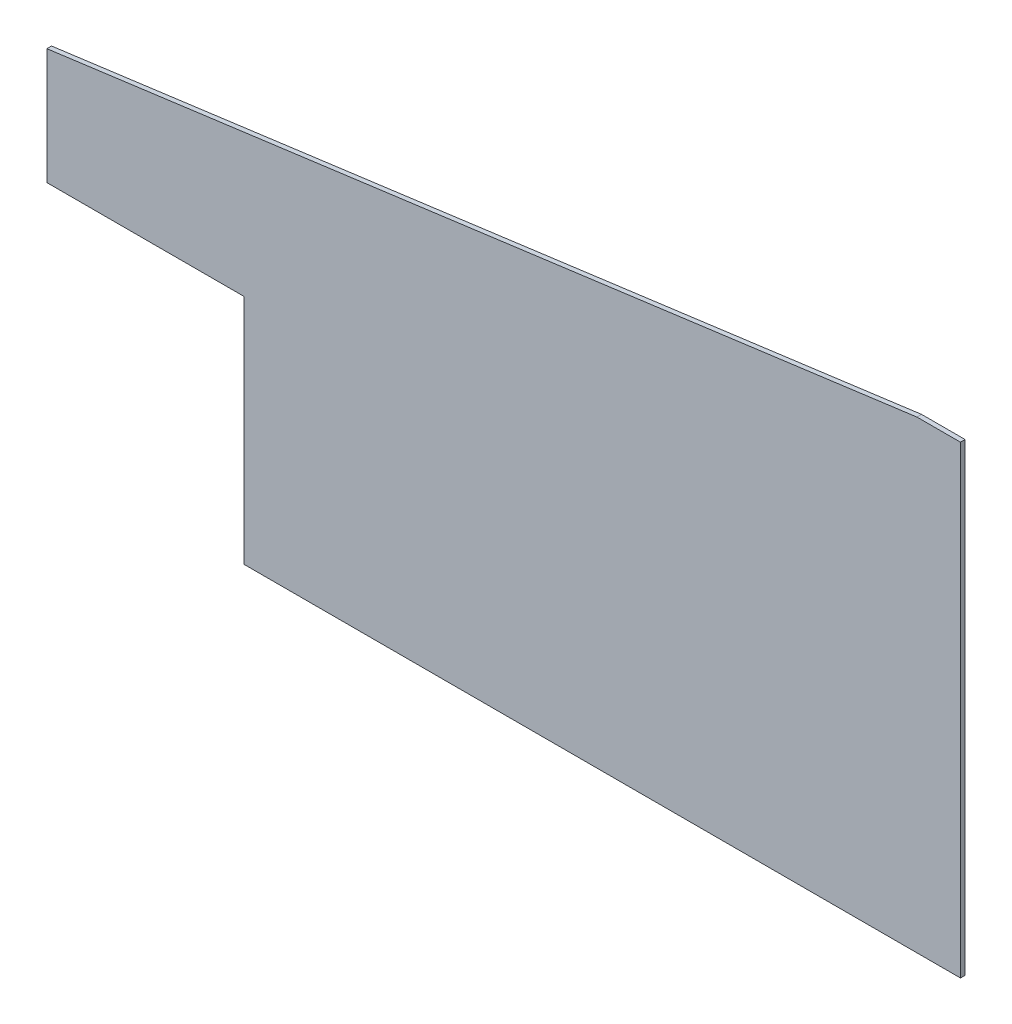
ISO-10303-21;
HEADER;
FILE_DESCRIPTION(('STEP AP214'),'2;1');
FILE_NAME('part.step','',(''),(''),'','','');
FILE_SCHEMA(('AUTOMOTIVE_DESIGN { 1 0 10303 214 1 1 1 1 }'));
ENDSEC;
DATA;
#1=APPLICATION_CONTEXT('core data for automotive mechanical design processes');
#2=APPLICATION_PROTOCOL_DEFINITION('international standard','automotive_design',2000,#1);
#3=PRODUCT_CONTEXT('',#1,'mechanical');
#4=PRODUCT('Part','Part','',(#3));
#5=PRODUCT_RELATED_PRODUCT_CATEGORY('part','',(#4));
#6=PRODUCT_DEFINITION_FORMATION('','',#4);
#7=PRODUCT_DEFINITION_CONTEXT('part definition',#1,'design');
#8=PRODUCT_DEFINITION('design','',#6,#7);
#9=PRODUCT_DEFINITION_SHAPE('','',#8);
#10=(LENGTH_UNIT() NAMED_UNIT(*) SI_UNIT(.MILLI.,.METRE.));
#11=(NAMED_UNIT(*) PLANE_ANGLE_UNIT() SI_UNIT($,.RADIAN.));
#12=(NAMED_UNIT(*) SI_UNIT($,.STERADIAN.) SOLID_ANGLE_UNIT());
#13=UNCERTAINTY_MEASURE_WITH_UNIT(LENGTH_MEASURE(1.E-05),#10,'distance_accuracy_value','');
#14=(GEOMETRIC_REPRESENTATION_CONTEXT(3) GLOBAL_UNCERTAINTY_ASSIGNED_CONTEXT((#13)) GLOBAL_UNIT_ASSIGNED_CONTEXT((#10,
#11,#12)) REPRESENTATION_CONTEXT('',''));
#15=CARTESIAN_POINT('',(0.,0.,0.));
#16=DIRECTION('',(0.,0.,1.));
#17=DIRECTION('',(1.,0.,0.));
#18=AXIS2_PLACEMENT_3D('',#15,#16,#17);
#19=CARTESIAN_POINT('',(0.,0.,4.));
#20=DIRECTION('',(0.,-1.,0.));
#21=DIRECTION('',(1.,0.,0.));
#22=AXIS2_PLACEMENT_3D('',#19,#20,#21);
#23=PLANE('',#22);
#24=DIRECTION('',(-1.,0.,0.));
#25=VECTOR('',#24,1.);
#26=CARTESIAN_POINT('',(0.,0.,0.));
#27=LINE('',#26,#25);
#28=CARTESIAN_POINT('',(0.,0.,0.));
#29=VERTEX_POINT('',#28);
#30=CARTESIAN_POINT('',(-37.5,0.,0.));
#31=VERTEX_POINT('',#30);
#32=EDGE_CURVE('E122',#29,#31,#27,.T.);
#33=ORIENTED_EDGE('',*,*,#32,.T.);
#34=DIRECTION('',(0.,0.,-1.));
#35=VECTOR('',#34,1.);
#36=CARTESIAN_POINT('',(-37.5,0.,4.));
#37=LINE('',#36,#35);
#38=CARTESIAN_POINT('',(-37.5,0.,4.));
#39=VERTEX_POINT('',#38);
#40=EDGE_CURVE('E11',#39,#31,#37,.T.);
#41=ORIENTED_EDGE('',*,*,#40,.F.);
#42=DIRECTION('',(-1.,0.,0.));
#43=VECTOR('',#42,1.);
#44=CARTESIAN_POINT('',(0.,0.,4.));
#45=LINE('',#44,#43);
#46=CARTESIAN_POINT('',(0.,0.,4.));
#47=VERTEX_POINT('',#46);
#48=EDGE_CURVE('E134',#47,#39,#45,.T.);
#49=ORIENTED_EDGE('',*,*,#48,.F.);
#50=DIRECTION('',(0.,0.,-1.));
#51=VECTOR('',#50,1.);
#52=CARTESIAN_POINT('',(0.,0.,4.));
#53=LINE('',#52,#51);
#54=EDGE_CURVE('E118',#47,#29,#53,.T.);
#55=ORIENTED_EDGE('',*,*,#54,.T.);
#56=EDGE_LOOP('',(#33,#41,#49,#55));
#57=FACE_BOUND('',#56,.T.);
#58=ADVANCED_FACE('F32',(#57),#23,.F.);
#59=CARTESIAN_POINT('',(-787.5,-100.,4.));
#60=DIRECTION('',(0.132163720091018,-0.991227900682635,0.));
#61=DIRECTION('',(0.991227900682635,0.132163720091018,0.));
#62=AXIS2_PLACEMENT_3D('',#59,#60,#61);
#63=PLANE('',#62);
#64=DIRECTION('',(-0.991227900682635,-0.132163720091018,0.));
#65=VECTOR('',#64,1.);
#66=CARTESIAN_POINT('',(-787.5,-100.,0.));
#67=LINE('',#66,#65);
#68=CARTESIAN_POINT('',(-787.5,-100.,0.));
#69=VERTEX_POINT('',#68);
#70=EDGE_CURVE('E125',#31,#69,#67,.T.);
#71=ORIENTED_EDGE('',*,*,#70,.T.);
#72=DIRECTION('',(0.,0.,-1.));
#73=VECTOR('',#72,1.);
#74=CARTESIAN_POINT('',(-787.5,-100.,4.));
#75=LINE('',#74,#73);
#76=CARTESIAN_POINT('',(-787.5,-100.,4.));
#77=VERTEX_POINT('',#76);
#78=EDGE_CURVE('E40',#77,#69,#75,.T.);
#79=ORIENTED_EDGE('',*,*,#78,.F.);
#80=DIRECTION('',(-0.991227900682635,-0.132163720091018,0.));
#81=VECTOR('',#80,1.);
#82=CARTESIAN_POINT('',(-787.5,-100.,4.));
#83=LINE('',#82,#81);
#84=EDGE_CURVE('E88',#39,#77,#83,.T.);
#85=ORIENTED_EDGE('',*,*,#84,.F.);
#86=ORIENTED_EDGE('',*,*,#40,.T.);
#87=EDGE_LOOP('',(#71,#79,#85,#86));
#88=FACE_BOUND('',#87,.T.);
#89=ADVANCED_FACE('F159',(#88),#63,.F.);
#90=CARTESIAN_POINT('',(-787.5,-100.,4.));
#91=DIRECTION('',(1.,0.,0.));
#92=DIRECTION('',(0.,0.,-1.));
#93=AXIS2_PLACEMENT_3D('',#90,#91,#92);
#94=PLANE('',#93);
#95=DIRECTION('',(0.,-1.,0.));
#96=VECTOR('',#95,1.);
#97=CARTESIAN_POINT('',(-787.5,-100.,0.));
#98=LINE('',#97,#96);
#99=CARTESIAN_POINT('',(-787.5,-200.,0.));
#100=VERTEX_POINT('',#99);
#101=EDGE_CURVE('E127',#69,#100,#98,.T.);
#102=ORIENTED_EDGE('',*,*,#101,.T.);
#103=DIRECTION('',(0.,0.,-1.));
#104=VECTOR('',#103,1.);
#105=CARTESIAN_POINT('',(-787.5,-200.,4.));
#106=LINE('',#105,#104);
#107=CARTESIAN_POINT('',(-787.5,-200.,4.));
#108=VERTEX_POINT('',#107);
#109=EDGE_CURVE('E138',#108,#100,#106,.T.);
#110=ORIENTED_EDGE('',*,*,#109,.F.);
#111=DIRECTION('',(0.,-1.,0.));
#112=VECTOR('',#111,1.);
#113=CARTESIAN_POINT('',(-787.5,-100.,4.));
#114=LINE('',#113,#112);
#115=EDGE_CURVE('E146',#77,#108,#114,.T.);
#116=ORIENTED_EDGE('',*,*,#115,.F.);
#117=ORIENTED_EDGE('',*,*,#78,.T.);
#118=EDGE_LOOP('',(#102,#110,#116,#117));
#119=FACE_BOUND('',#118,.T.);
#120=ADVANCED_FACE('F144',(#119),#94,.F.);
#121=CARTESIAN_POINT('',(-787.5,-200.,4.));
#122=DIRECTION('',(0.,1.,0.));
#123=DIRECTION('',(-1.,0.,0.));
#124=AXIS2_PLACEMENT_3D('',#121,#122,#123);
#125=PLANE('',#124);
#126=DIRECTION('',(1.,0.,0.));
#127=VECTOR('',#126,1.);
#128=CARTESIAN_POINT('',(-787.5,-200.,0.));
#129=LINE('',#128,#127);
#130=CARTESIAN_POINT('',(-617.5,-200.,0.));
#131=VERTEX_POINT('',#130);
#132=EDGE_CURVE('E129',#100,#131,#129,.T.);
#133=ORIENTED_EDGE('',*,*,#132,.T.);
#134=DIRECTION('',(0.,0.,-1.));
#135=VECTOR('',#134,1.);
#136=CARTESIAN_POINT('',(-617.5,-200.,4.));
#137=LINE('',#136,#135);
#138=CARTESIAN_POINT('',(-617.5,-200.,4.));
#139=VERTEX_POINT('',#138);
#140=EDGE_CURVE('E113',#139,#131,#137,.T.);
#141=ORIENTED_EDGE('',*,*,#140,.F.);
#142=DIRECTION('',(1.,0.,0.));
#143=VECTOR('',#142,1.);
#144=CARTESIAN_POINT('',(-787.5,-200.,4.));
#145=LINE('',#144,#143);
#146=EDGE_CURVE('E104',#108,#139,#145,.T.);
#147=ORIENTED_EDGE('',*,*,#146,.F.);
#148=ORIENTED_EDGE('',*,*,#109,.T.);
#149=EDGE_LOOP('',(#133,#141,#147,#148));
#150=FACE_BOUND('',#149,.T.);
#151=ADVANCED_FACE('F152',(#150),#125,.F.);
#152=CARTESIAN_POINT('',(-617.5,-200.,4.));
#153=DIRECTION('',(1.,0.,0.));
#154=DIRECTION('',(0.,0.,-1.));
#155=AXIS2_PLACEMENT_3D('',#152,#153,#154);
#156=PLANE('',#155);
#157=DIRECTION('',(0.,-1.,0.));
#158=VECTOR('',#157,1.);
#159=CARTESIAN_POINT('',(-617.5,-200.,0.));
#160=LINE('',#159,#158);
#161=CARTESIAN_POINT('',(-617.5,-400.,0.));
#162=VERTEX_POINT('',#161);
#163=EDGE_CURVE('E112',#131,#162,#160,.T.);
#164=ORIENTED_EDGE('',*,*,#163,.T.);
#165=DIRECTION('',(0.,0.,-1.));
#166=VECTOR('',#165,1.);
#167=CARTESIAN_POINT('',(-617.5,-400.,4.));
#168=LINE('',#167,#166);
#169=CARTESIAN_POINT('',(-617.5,-400.,4.));
#170=VERTEX_POINT('',#169);
#171=EDGE_CURVE('E109',#170,#162,#168,.T.);
#172=ORIENTED_EDGE('',*,*,#171,.F.);
#173=DIRECTION('',(0.,-1.,0.));
#174=VECTOR('',#173,1.);
#175=CARTESIAN_POINT('',(-617.5,-200.,4.));
#176=LINE('',#175,#174);
#177=EDGE_CURVE('E98',#139,#170,#176,.T.);
#178=ORIENTED_EDGE('',*,*,#177,.F.);
#179=ORIENTED_EDGE('',*,*,#140,.T.);
#180=EDGE_LOOP('',(#164,#172,#178,#179));
#181=FACE_BOUND('',#180,.T.);
#182=ADVANCED_FACE('F110',(#181),#156,.F.);
#183=CARTESIAN_POINT('',(-617.5,-400.,4.));
#184=DIRECTION('',(0.,1.,0.));
#185=DIRECTION('',(0.,0.,1.));
#186=AXIS2_PLACEMENT_3D('',#183,#184,#185);
#187=PLANE('',#186);
#188=DIRECTION('',(1.,0.,0.));
#189=VECTOR('',#188,1.);
#190=CARTESIAN_POINT('',(-617.5,-400.,0.));
#191=LINE('',#190,#189);
#192=CARTESIAN_POINT('',(0.,-400.,0.));
#193=VERTEX_POINT('',#192);
#194=EDGE_CURVE('E74',#162,#193,#191,.T.);
#195=ORIENTED_EDGE('',*,*,#194,.T.);
#196=DIRECTION('',(0.,0.,-1.));
#197=VECTOR('',#196,1.);
#198=CARTESIAN_POINT('',(0.,-400.,4.));
#199=LINE('',#198,#197);
#200=CARTESIAN_POINT('',(0.,-400.,4.));
#201=VERTEX_POINT('',#200);
#202=EDGE_CURVE('E114',#201,#193,#199,.T.);
#203=ORIENTED_EDGE('',*,*,#202,.F.);
#204=DIRECTION('',(1.,0.,0.));
#205=VECTOR('',#204,1.);
#206=CARTESIAN_POINT('',(-617.5,-400.,4.));
#207=LINE('',#206,#205);
#208=EDGE_CURVE('E102',#170,#201,#207,.T.);
#209=ORIENTED_EDGE('',*,*,#208,.F.);
#210=ORIENTED_EDGE('',*,*,#171,.T.);
#211=EDGE_LOOP('',(#195,#203,#209,#210));
#212=FACE_BOUND('',#211,.T.);
#213=ADVANCED_FACE('F116',(#212),#187,.F.);
#214=CARTESIAN_POINT('',(0.,-400.,4.));
#215=DIRECTION('',(-1.,0.,0.));
#216=DIRECTION('',(0.,0.,1.));
#217=AXIS2_PLACEMENT_3D('',#214,#215,#216);
#218=PLANE('',#217);
#219=DIRECTION('',(0.,1.,0.));
#220=VECTOR('',#219,1.);
#221=CARTESIAN_POINT('',(0.,-400.,0.));
#222=LINE('',#221,#220);
#223=EDGE_CURVE('E80',#193,#29,#222,.T.);
#224=ORIENTED_EDGE('',*,*,#223,.T.);
#225=ORIENTED_EDGE('',*,*,#54,.F.);
#226=DIRECTION('',(0.,1.,0.));
#227=VECTOR('',#226,1.);
#228=CARTESIAN_POINT('',(0.,-400.,4.));
#229=LINE('',#228,#227);
#230=EDGE_CURVE('E48',#201,#47,#229,.T.);
#231=ORIENTED_EDGE('',*,*,#230,.F.);
#232=ORIENTED_EDGE('',*,*,#202,.T.);
#233=EDGE_LOOP('',(#224,#225,#231,#232));
#234=FACE_BOUND('',#233,.T.);
#235=ADVANCED_FACE('F173',(#234),#218,.F.);
#236=CARTESIAN_POINT('',(0.,0.,4.));
#237=DIRECTION('',(0.,0.,1.));
#238=DIRECTION('',(1.,0.,0.));
#239=AXIS2_PLACEMENT_3D('',#236,#237,#238);
#240=PLANE('',#239);
#241=ORIENTED_EDGE('',*,*,#48,.T.);
#242=ORIENTED_EDGE('',*,*,#84,.T.);
#243=ORIENTED_EDGE('',*,*,#115,.T.);
#244=ORIENTED_EDGE('',*,*,#146,.T.);
#245=ORIENTED_EDGE('',*,*,#177,.T.);
#246=ORIENTED_EDGE('',*,*,#208,.T.);
#247=ORIENTED_EDGE('',*,*,#230,.T.);
#248=EDGE_LOOP('',(#241,#242,#243,#244,#245,#246,#247));
#249=FACE_BOUND('',#248,.T.);
#250=ADVANCED_FACE('F100',(#249),#240,.T.);
#251=CARTESIAN_POINT('',(0.,0.,0.));
#252=DIRECTION('',(0.,0.,1.));
#253=DIRECTION('',(1.,0.,0.));
#254=AXIS2_PLACEMENT_3D('',#251,#252,#253);
#255=PLANE('',#254);
#256=ORIENTED_EDGE('',*,*,#32,.F.);
#257=ORIENTED_EDGE('',*,*,#223,.F.);
#258=ORIENTED_EDGE('',*,*,#194,.F.);
#259=ORIENTED_EDGE('',*,*,#163,.F.);
#260=ORIENTED_EDGE('',*,*,#132,.F.);
#261=ORIENTED_EDGE('',*,*,#101,.F.);
#262=ORIENTED_EDGE('',*,*,#70,.F.);
#263=EDGE_LOOP('',(#256,#257,#258,#259,#260,#261,#262));
#264=FACE_BOUND('',#263,.T.);
#265=ADVANCED_FACE('F150',(#264),#255,.F.);
#266=CLOSED_SHELL('',(#58,#89,#120,#151,#182,#213,#235,#250,#265));
#267=MANIFOLD_SOLID_BREP('B2',#266);
#268=ADVANCED_BREP_SHAPE_REPRESENTATION('',(#18,#267),#14);
#269=SHAPE_DEFINITION_REPRESENTATION(#9,#268);
ENDSEC;
END-ISO-10303-21;
